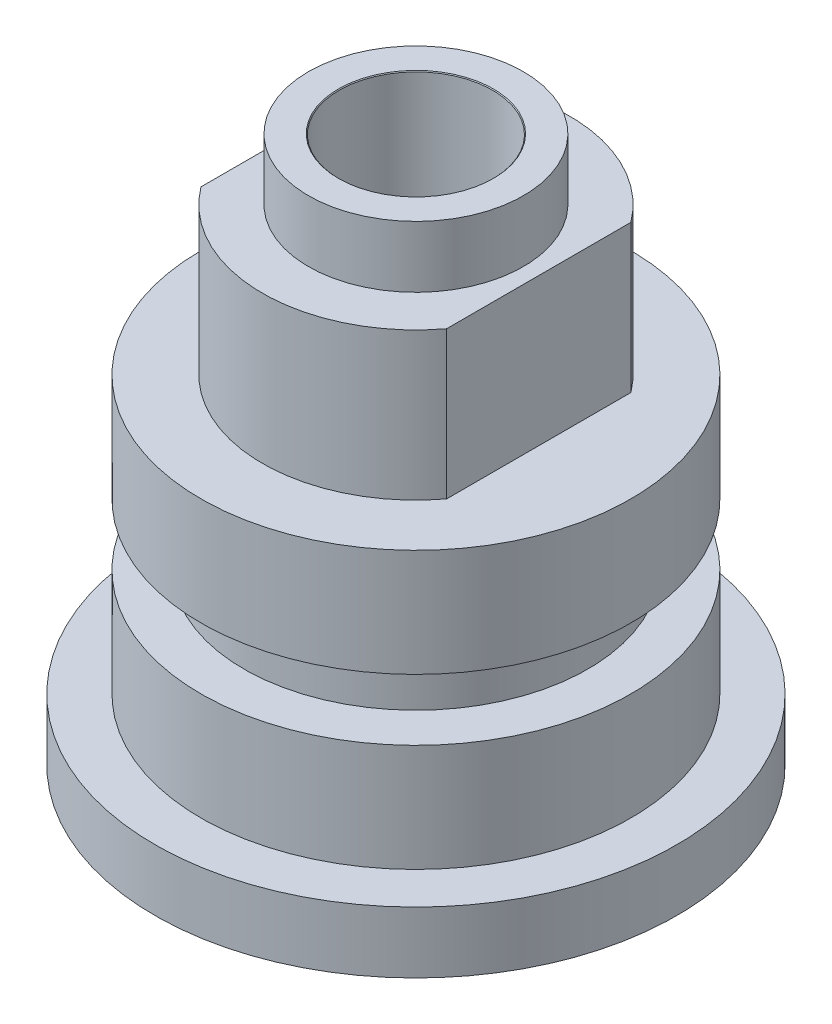
ISO-10303-21;
HEADER;
FILE_DESCRIPTION(('STEP AP214'),'2;1');
FILE_NAME('part.step','',(''),(''),'','','');
FILE_SCHEMA(('AUTOMOTIVE_DESIGN { 1 0 10303 214 1 1 1 1 }'));
ENDSEC;
DATA;
#1=APPLICATION_CONTEXT('core data for automotive mechanical design processes');
#2=APPLICATION_PROTOCOL_DEFINITION('international standard','automotive_design',2000,#1);
#3=PRODUCT_CONTEXT('',#1,'mechanical');
#4=PRODUCT('Part','Part','',(#3));
#5=PRODUCT_RELATED_PRODUCT_CATEGORY('part','',(#4));
#6=PRODUCT_DEFINITION_FORMATION('','',#4);
#7=PRODUCT_DEFINITION_CONTEXT('part definition',#1,'design');
#8=PRODUCT_DEFINITION('design','',#6,#7);
#9=PRODUCT_DEFINITION_SHAPE('','',#8);
#10=(LENGTH_UNIT() NAMED_UNIT(*) SI_UNIT(.MILLI.,.METRE.));
#11=(NAMED_UNIT(*) PLANE_ANGLE_UNIT() SI_UNIT($,.RADIAN.));
#12=(NAMED_UNIT(*) SI_UNIT($,.STERADIAN.) SOLID_ANGLE_UNIT());
#13=UNCERTAINTY_MEASURE_WITH_UNIT(LENGTH_MEASURE(1.E-05),#10,'distance_accuracy_value','');
#14=(GEOMETRIC_REPRESENTATION_CONTEXT(3) GLOBAL_UNCERTAINTY_ASSIGNED_CONTEXT((#13)) GLOBAL_UNIT_ASSIGNED_CONTEXT((#10,
#11,#12)) REPRESENTATION_CONTEXT('',''));
#15=CARTESIAN_POINT('',(0.,0.,0.));
#16=DIRECTION('',(0.,0.,1.));
#17=DIRECTION('',(1.,0.,0.));
#18=AXIS2_PLACEMENT_3D('',#15,#16,#17);
#19=CARTESIAN_POINT('',(0.,19.8,0.));
#20=DIRECTION('',(0.,1.,0.));
#21=DIRECTION('',(-1.,0.,0.));
#22=AXIS2_PLACEMENT_3D('',#19,#20,#21);
#23=CYLINDRICAL_SURFACE('',#22,5.);
#24=CARTESIAN_POINT('',(0.,0.,0.));
#25=DIRECTION('',(0.,1.,0.));
#26=DIRECTION('',(-1.,0.,0.));
#27=AXIS2_PLACEMENT_3D('',#24,#25,#26);
#28=CIRCLE('',#27,5.);
#29=CARTESIAN_POINT('',(2.5,0.,-4.33012701892219));
#30=VERTEX_POINT('',#29);
#31=CARTESIAN_POINT('',(-2.5,0.,-4.3301270189222));
#32=VERTEX_POINT('',#31);
#33=EDGE_CURVE('E45',#30,#32,#28,.T.);
#34=ORIENTED_EDGE('',*,*,#33,.T.);
#35=DIRECTION('',(0.,-1.,0.));
#36=VECTOR('',#35,1.);
#37=CARTESIAN_POINT('',(-2.5,11.01387818866,-4.3301270189222));
#38=LINE('',#37,#36);
#39=CARTESIAN_POINT('',(-2.5,2.,-4.3301270189222));
#40=VERTEX_POINT('',#39);
#41=EDGE_CURVE('E139',#40,#32,#38,.T.);
#42=ORIENTED_EDGE('',*,*,#41,.F.);
#43=CARTESIAN_POINT('',(0.,2.,0.));
#44=DIRECTION('',(0.,1.,0.));
#45=DIRECTION('',(-1.,0.,0.));
#46=AXIS2_PLACEMENT_3D('',#43,#44,#45);
#47=CIRCLE('',#46,5.);
#48=CARTESIAN_POINT('',(2.5,2.,-4.3301270189222));
#49=VERTEX_POINT('',#48);
#50=EDGE_CURVE('E204',#49,#40,#47,.T.);
#51=ORIENTED_EDGE('',*,*,#50,.F.);
#52=DIRECTION('',(0.,-1.,0.));
#53=VECTOR('',#52,1.);
#54=CARTESIAN_POINT('',(2.5,11.01387818866,-4.33012701892219));
#55=LINE('',#54,#53);
#56=EDGE_CURVE('E144',#49,#30,#55,.T.);
#57=ORIENTED_EDGE('',*,*,#56,.T.);
#58=EDGE_LOOP('',(#34,#42,#51,#57));
#59=FACE_BOUND('',#58,.T.);
#60=ADVANCED_FACE('F37',(#59),#23,.T.);
#61=CARTESIAN_POINT('',(0.,19.8,0.));
#62=DIRECTION('',(0.,1.,0.));
#63=DIRECTION('',(-1.,0.,0.));
#64=AXIS2_PLACEMENT_3D('',#61,#62,#63);
#65=CYLINDRICAL_SURFACE('',#64,5.);
#66=CARTESIAN_POINT('',(0.,13.,0.));
#67=DIRECTION('',(0.,1.,0.));
#68=DIRECTION('',(-1.,0.,0.));
#69=AXIS2_PLACEMENT_3D('',#66,#67,#68);
#70=CIRCLE('',#69,5.);
#71=CARTESIAN_POINT('',(4.,13.,-3.));
#72=VERTEX_POINT('',#71);
#73=CARTESIAN_POINT('',(-4.,13.,-3.));
#74=VERTEX_POINT('',#73);
#75=EDGE_CURVE('E177',#72,#74,#70,.T.);
#76=ORIENTED_EDGE('',*,*,#75,.T.);
#77=DIRECTION('',(0.,1.,0.));
#78=VECTOR('',#77,1.);
#79=CARTESIAN_POINT('',(-4.,6.91723746970177,-3.));
#80=LINE('',#79,#78);
#81=CARTESIAN_POINT('',(-4.,17.8,-3.));
#82=VERTEX_POINT('',#81);
#83=EDGE_CURVE('E154',#74,#82,#80,.T.);
#84=ORIENTED_EDGE('',*,*,#83,.T.);
#85=CARTESIAN_POINT('',(0.,17.8,0.));
#86=DIRECTION('',(0.,1.,0.));
#87=DIRECTION('',(-1.,0.,0.));
#88=AXIS2_PLACEMENT_3D('',#85,#86,#87);
#89=CIRCLE('',#88,5.);
#90=CARTESIAN_POINT('',(4.,17.8,-3.));
#91=VERTEX_POINT('',#90);
#92=EDGE_CURVE('E173',#91,#82,#89,.T.);
#93=ORIENTED_EDGE('',*,*,#92,.F.);
#94=DIRECTION('',(0.,1.,0.));
#95=VECTOR('',#94,1.);
#96=CARTESIAN_POINT('',(4.,6.91723746970177,-3.));
#97=LINE('',#96,#95);
#98=EDGE_CURVE('E151',#72,#91,#97,.T.);
#99=ORIENTED_EDGE('',*,*,#98,.F.);
#100=EDGE_LOOP('',(#76,#84,#93,#99));
#101=FACE_BOUND('',#100,.T.);
#102=ADVANCED_FACE('F237',(#101),#65,.T.);
#103=CARTESIAN_POINT('',(0.,0.,0.));
#104=DIRECTION('',(0.,1.,0.));
#105=DIRECTION('',(-1.,0.,0.));
#106=AXIS2_PLACEMENT_3D('',#103,#104,#105);
#107=PLANE('',#106);
#108=CARTESIAN_POINT('',(0.,0.,0.));
#109=DIRECTION('',(0.,-1.,0.));
#110=DIRECTION('',(0.,0.,-1.));
#111=AXIS2_PLACEMENT_3D('',#108,#109,#110);
#112=CIRCLE('',#111,2.025);
#113=CARTESIAN_POINT('',(0.,0.,-2.025));
#114=VERTEX_POINT('',#113);
#115=EDGE_CURVE('E115',#114,#114,#112,.T.);
#116=ORIENTED_EDGE('',*,*,#115,.F.);
#117=EDGE_LOOP('',(#116));
#118=FACE_BOUND('',#117,.T.);
#119=CARTESIAN_POINT('',(-2.5,0.,4.3301270189222));
#120=VERTEX_POINT('',#119);
#121=CARTESIAN_POINT('',(2.5,0.,4.33012701892219));
#122=VERTEX_POINT('',#121);
#123=EDGE_CURVE('E11',#120,#122,#28,.T.);
#124=ORIENTED_EDGE('',*,*,#123,.F.);
#125=DIRECTION('',(0.,0.,1.));
#126=VECTOR('',#125,1.);
#127=CARTESIAN_POINT('',(-2.5,0.,4.3301270189222));
#128=LINE('',#127,#126);
#129=EDGE_CURVE('E132',#32,#120,#128,.T.);
#130=ORIENTED_EDGE('',*,*,#129,.F.);
#131=ORIENTED_EDGE('',*,*,#33,.F.);
#132=DIRECTION('',(0.,0.,-1.));
#133=VECTOR('',#132,1.);
#134=CARTESIAN_POINT('',(2.5,0.,4.33012701892219));
#135=LINE('',#134,#133);
#136=EDGE_CURVE('E131',#122,#30,#135,.T.);
#137=ORIENTED_EDGE('',*,*,#136,.F.);
#138=EDGE_LOOP('',(#124,#130,#131,#137));
#139=FACE_BOUND('',#138,.T.);
#140=ADVANCED_FACE('F39',(#118,#139),#107,.F.);
#141=CARTESIAN_POINT('',(-2.5,2.,4.3301270189222));
#142=VERTEX_POINT('',#141);
#143=CARTESIAN_POINT('',(2.5,2.,4.33012701892219));
#144=VERTEX_POINT('',#143);
#145=EDGE_CURVE('E205',#142,#144,#47,.T.);
#146=ORIENTED_EDGE('',*,*,#145,.F.);
#147=DIRECTION('',(0.,-1.,0.));
#148=VECTOR('',#147,1.);
#149=CARTESIAN_POINT('',(-2.5,11.01387818866,4.3301270189222));
#150=LINE('',#149,#148);
#151=EDGE_CURVE('E136',#142,#120,#150,.T.);
#152=ORIENTED_EDGE('',*,*,#151,.T.);
#153=ORIENTED_EDGE('',*,*,#123,.T.);
#154=DIRECTION('',(0.,-1.,0.));
#155=VECTOR('',#154,1.);
#156=CARTESIAN_POINT('',(2.5,11.01387818866,4.33012701892219));
#157=LINE('',#156,#155);
#158=EDGE_CURVE('E134',#144,#122,#157,.T.);
#159=ORIENTED_EDGE('',*,*,#158,.F.);
#160=EDGE_LOOP('',(#146,#152,#153,#159));
#161=FACE_BOUND('',#160,.T.);
#162=ADVANCED_FACE('F221',(#161),#23,.T.);
#163=CARTESIAN_POINT('',(5.,2.,0.));
#164=DIRECTION('',(0.,1.,0.));
#165=DIRECTION('',(-1.,0.,0.));
#166=AXIS2_PLACEMENT_3D('',#163,#164,#165);
#167=PLANE('',#166);
#168=CARTESIAN_POINT('',(0.,2.,0.));
#169=DIRECTION('',(0.,1.,0.));
#170=DIRECTION('',(-1.,0.,0.));
#171=AXIS2_PLACEMENT_3D('',#168,#169,#170);
#172=CIRCLE('',#171,8.5);
#173=CARTESIAN_POINT('',(-8.5,2.,0.));
#174=VERTEX_POINT('',#173);
#175=EDGE_CURVE('E202',#174,#174,#172,.T.);
#176=ORIENTED_EDGE('',*,*,#175,.F.);
#177=EDGE_LOOP('',(#176));
#178=FACE_BOUND('',#177,.T.);
#179=ORIENTED_EDGE('',*,*,#145,.T.);
#180=DIRECTION('',(0.,0.,-1.));
#181=VECTOR('',#180,1.);
#182=CARTESIAN_POINT('',(2.5,2.,4.33012701892219));
#183=LINE('',#182,#181);
#184=EDGE_CURVE('E52',#144,#49,#183,.T.);
#185=ORIENTED_EDGE('',*,*,#184,.T.);
#186=ORIENTED_EDGE('',*,*,#50,.T.);
#187=DIRECTION('',(0.,0.,1.));
#188=VECTOR('',#187,1.);
#189=CARTESIAN_POINT('',(-2.5,2.,4.3301270189222));
#190=LINE('',#189,#188);
#191=EDGE_CURVE('E57',#40,#142,#190,.T.);
#192=ORIENTED_EDGE('',*,*,#191,.T.);
#193=EDGE_LOOP('',(#179,#185,#186,#192));
#194=FACE_BOUND('',#193,.T.);
#195=ADVANCED_FACE('F209',(#178,#194),#167,.F.);
#196=CARTESIAN_POINT('',(0.,19.8,0.));
#197=DIRECTION('',(0.,1.,0.));
#198=DIRECTION('',(-1.,0.,0.));
#199=AXIS2_PLACEMENT_3D('',#196,#197,#198);
#200=CYLINDRICAL_SURFACE('',#199,8.5);
#201=CARTESIAN_POINT('',(0.,4.,0.));
#202=DIRECTION('',(0.,1.,0.));
#203=DIRECTION('',(-1.,0.,0.));
#204=AXIS2_PLACEMENT_3D('',#201,#202,#203);
#205=CIRCLE('',#204,8.5);
#206=CARTESIAN_POINT('',(-8.5,4.,0.));
#207=VERTEX_POINT('',#206);
#208=EDGE_CURVE('E199',#207,#207,#205,.T.);
#209=ORIENTED_EDGE('',*,*,#208,.F.);
#210=EDGE_LOOP('',(#209));
#211=FACE_BOUND('',#210,.T.);
#212=ORIENTED_EDGE('',*,*,#175,.T.);
#213=EDGE_LOOP('',(#212));
#214=FACE_BOUND('',#213,.T.);
#215=ADVANCED_FACE('F250',(#211,#214),#200,.T.);
#216=CARTESIAN_POINT('',(8.5,4.,0.));
#217=DIRECTION('',(0.,-1.,0.));
#218=DIRECTION('',(1.,0.,0.));
#219=AXIS2_PLACEMENT_3D('',#216,#217,#218);
#220=PLANE('',#219);
#221=CARTESIAN_POINT('',(0.,4.,0.));
#222=DIRECTION('',(0.,1.,0.));
#223=DIRECTION('',(-1.,0.,0.));
#224=AXIS2_PLACEMENT_3D('',#221,#222,#223);
#225=CIRCLE('',#224,7.);
#226=CARTESIAN_POINT('',(-7.,4.,0.));
#227=VERTEX_POINT('',#226);
#228=EDGE_CURVE('E196',#227,#227,#225,.T.);
#229=ORIENTED_EDGE('',*,*,#228,.F.);
#230=EDGE_LOOP('',(#229));
#231=FACE_BOUND('',#230,.T.);
#232=ORIENTED_EDGE('',*,*,#208,.T.);
#233=EDGE_LOOP('',(#232));
#234=FACE_BOUND('',#233,.T.);
#235=ADVANCED_FACE('F386',(#231,#234),#220,.F.);
#236=CARTESIAN_POINT('',(0.,19.8,0.));
#237=DIRECTION('',(0.,1.,0.));
#238=DIRECTION('',(-1.,0.,0.));
#239=AXIS2_PLACEMENT_3D('',#236,#237,#238);
#240=CYLINDRICAL_SURFACE('',#239,7.);
#241=CARTESIAN_POINT('',(0.,7.5,0.));
#242=DIRECTION('',(0.,1.,0.));
#243=DIRECTION('',(-1.,0.,0.));
#244=AXIS2_PLACEMENT_3D('',#241,#242,#243);
#245=CIRCLE('',#244,7.);
#246=CARTESIAN_POINT('',(-7.,7.5,0.));
#247=VERTEX_POINT('',#246);
#248=EDGE_CURVE('E193',#247,#247,#245,.T.);
#249=ORIENTED_EDGE('',*,*,#248,.F.);
#250=EDGE_LOOP('',(#249));
#251=FACE_BOUND('',#250,.T.);
#252=ORIENTED_EDGE('',*,*,#228,.T.);
#253=EDGE_LOOP('',(#252));
#254=FACE_BOUND('',#253,.T.);
#255=ADVANCED_FACE('F382',(#251,#254),#240,.T.);
#256=CARTESIAN_POINT('',(7.,7.5,0.));
#257=DIRECTION('',(0.,-1.,0.));
#258=DIRECTION('',(1.,0.,0.));
#259=AXIS2_PLACEMENT_3D('',#256,#257,#258);
#260=PLANE('',#259);
#261=CARTESIAN_POINT('',(0.,7.5,0.));
#262=DIRECTION('',(0.,1.,0.));
#263=DIRECTION('',(-1.,0.,0.));
#264=AXIS2_PLACEMENT_3D('',#261,#262,#263);
#265=CIRCLE('',#264,5.6);
#266=CARTESIAN_POINT('',(-5.6,7.5,0.));
#267=VERTEX_POINT('',#266);
#268=EDGE_CURVE('E190',#267,#267,#265,.T.);
#269=ORIENTED_EDGE('',*,*,#268,.F.);
#270=EDGE_LOOP('',(#269));
#271=FACE_BOUND('',#270,.T.);
#272=ORIENTED_EDGE('',*,*,#248,.T.);
#273=EDGE_LOOP('',(#272));
#274=FACE_BOUND('',#273,.T.);
#275=ADVANCED_FACE('F378',(#271,#274),#260,.F.);
#276=CARTESIAN_POINT('',(0.,19.8,0.));
#277=DIRECTION('',(0.,1.,0.));
#278=DIRECTION('',(-1.,0.,0.));
#279=AXIS2_PLACEMENT_3D('',#276,#277,#278);
#280=CYLINDRICAL_SURFACE('',#279,5.6);
#281=CARTESIAN_POINT('',(0.,9.5,0.));
#282=DIRECTION('',(0.,1.,0.));
#283=DIRECTION('',(-1.,0.,0.));
#284=AXIS2_PLACEMENT_3D('',#281,#282,#283);
#285=CIRCLE('',#284,5.6);
#286=CARTESIAN_POINT('',(-5.6,9.5,0.));
#287=VERTEX_POINT('',#286);
#288=EDGE_CURVE('E187',#287,#287,#285,.T.);
#289=ORIENTED_EDGE('',*,*,#288,.F.);
#290=EDGE_LOOP('',(#289));
#291=FACE_BOUND('',#290,.T.);
#292=ORIENTED_EDGE('',*,*,#268,.T.);
#293=EDGE_LOOP('',(#292));
#294=FACE_BOUND('',#293,.T.);
#295=ADVANCED_FACE('F374',(#291,#294),#280,.T.);
#296=CARTESIAN_POINT('',(5.6,9.5,0.));
#297=DIRECTION('',(0.,1.,0.));
#298=DIRECTION('',(-1.,0.,0.));
#299=AXIS2_PLACEMENT_3D('',#296,#297,#298);
#300=PLANE('',#299);
#301=CARTESIAN_POINT('',(0.,9.5,0.));
#302=DIRECTION('',(0.,1.,0.));
#303=DIRECTION('',(-1.,0.,0.));
#304=AXIS2_PLACEMENT_3D('',#301,#302,#303);
#305=CIRCLE('',#304,7.);
#306=CARTESIAN_POINT('',(-7.,9.5,0.));
#307=VERTEX_POINT('',#306);
#308=EDGE_CURVE('E184',#307,#307,#305,.T.);
#309=ORIENTED_EDGE('',*,*,#308,.F.);
#310=EDGE_LOOP('',(#309));
#311=FACE_BOUND('',#310,.T.);
#312=ORIENTED_EDGE('',*,*,#288,.T.);
#313=EDGE_LOOP('',(#312));
#314=FACE_BOUND('',#313,.T.);
#315=ADVANCED_FACE('F370',(#311,#314),#300,.F.);
#316=CARTESIAN_POINT('',(0.,19.8,0.));
#317=DIRECTION('',(0.,1.,0.));
#318=DIRECTION('',(-1.,0.,0.));
#319=AXIS2_PLACEMENT_3D('',#316,#317,#318);
#320=CYLINDRICAL_SURFACE('',#319,7.);
#321=CARTESIAN_POINT('',(0.,13.,0.));
#322=DIRECTION('',(0.,1.,0.));
#323=DIRECTION('',(-1.,0.,0.));
#324=AXIS2_PLACEMENT_3D('',#321,#322,#323);
#325=CIRCLE('',#324,7.);
#326=CARTESIAN_POINT('',(-7.,13.,0.));
#327=VERTEX_POINT('',#326);
#328=EDGE_CURVE('E181',#327,#327,#325,.T.);
#329=ORIENTED_EDGE('',*,*,#328,.F.);
#330=EDGE_LOOP('',(#329));
#331=FACE_BOUND('',#330,.T.);
#332=ORIENTED_EDGE('',*,*,#308,.T.);
#333=EDGE_LOOP('',(#332));
#334=FACE_BOUND('',#333,.T.);
#335=ADVANCED_FACE('F367',(#331,#334),#320,.T.);
#336=CARTESIAN_POINT('',(7.,13.,0.));
#337=DIRECTION('',(0.,-1.,0.));
#338=DIRECTION('',(1.,0.,0.));
#339=AXIS2_PLACEMENT_3D('',#336,#337,#338);
#340=PLANE('',#339);
#341=CARTESIAN_POINT('',(-4.,13.,3.));
#342=VERTEX_POINT('',#341);
#343=CARTESIAN_POINT('',(4.,13.,3.));
#344=VERTEX_POINT('',#343);
#345=EDGE_CURVE('E178',#342,#344,#70,.T.);
#346=ORIENTED_EDGE('',*,*,#345,.F.);
#347=DIRECTION('',(0.,0.,-1.));
#348=VECTOR('',#347,1.);
#349=CARTESIAN_POINT('',(-4.,13.,-3.));
#350=LINE('',#349,#348);
#351=EDGE_CURVE('E150',#342,#74,#350,.T.);
#352=ORIENTED_EDGE('',*,*,#351,.T.);
#353=ORIENTED_EDGE('',*,*,#75,.F.);
#354=DIRECTION('',(0.,0.,1.));
#355=VECTOR('',#354,1.);
#356=CARTESIAN_POINT('',(4.,13.,-3.));
#357=LINE('',#356,#355);
#358=EDGE_CURVE('E161',#72,#344,#357,.T.);
#359=ORIENTED_EDGE('',*,*,#358,.T.);
#360=EDGE_LOOP('',(#346,#352,#353,#359));
#361=FACE_BOUND('',#360,.T.);
#362=ORIENTED_EDGE('',*,*,#328,.T.);
#363=EDGE_LOOP('',(#362));
#364=FACE_BOUND('',#363,.T.);
#365=ADVANCED_FACE('F356',(#361,#364),#340,.F.);
#366=CARTESIAN_POINT('',(-4.,17.8,3.));
#367=VERTEX_POINT('',#366);
#368=CARTESIAN_POINT('',(4.,17.8,3.));
#369=VERTEX_POINT('',#368);
#370=EDGE_CURVE('E174',#367,#369,#89,.T.);
#371=ORIENTED_EDGE('',*,*,#370,.F.);
#372=DIRECTION('',(0.,1.,0.));
#373=VECTOR('',#372,1.);
#374=CARTESIAN_POINT('',(-4.,6.91723746970177,3.));
#375=LINE('',#374,#373);
#376=EDGE_CURVE('E157',#342,#367,#375,.T.);
#377=ORIENTED_EDGE('',*,*,#376,.F.);
#378=ORIENTED_EDGE('',*,*,#345,.T.);
#379=DIRECTION('',(0.,1.,0.));
#380=VECTOR('',#379,1.);
#381=CARTESIAN_POINT('',(4.,6.91723746970177,3.));
#382=LINE('',#381,#380);
#383=EDGE_CURVE('E164',#344,#369,#382,.T.);
#384=ORIENTED_EDGE('',*,*,#383,.T.);
#385=EDGE_LOOP('',(#371,#377,#378,#384));
#386=FACE_BOUND('',#385,.T.);
#387=ADVANCED_FACE('F243',(#386),#65,.T.);
#388=CARTESIAN_POINT('',(5.,17.8,0.));
#389=DIRECTION('',(0.,-1.,0.));
#390=DIRECTION('',(1.,0.,0.));
#391=AXIS2_PLACEMENT_3D('',#388,#389,#390);
#392=PLANE('',#391);
#393=CARTESIAN_POINT('',(0.,17.8,0.));
#394=DIRECTION('',(0.,1.,0.));
#395=DIRECTION('',(-1.,0.,0.));
#396=AXIS2_PLACEMENT_3D('',#393,#394,#395);
#397=CIRCLE('',#396,3.5);
#398=CARTESIAN_POINT('',(-3.5,17.8,0.));
#399=VERTEX_POINT('',#398);
#400=EDGE_CURVE('E170',#399,#399,#397,.T.);
#401=ORIENTED_EDGE('',*,*,#400,.F.);
#402=EDGE_LOOP('',(#401));
#403=FACE_BOUND('',#402,.T.);
#404=ORIENTED_EDGE('',*,*,#92,.T.);
#405=DIRECTION('',(0.,0.,-1.));
#406=VECTOR('',#405,1.);
#407=CARTESIAN_POINT('',(-4.,17.8,-3.));
#408=LINE('',#407,#406);
#409=EDGE_CURVE('E148',#367,#82,#408,.T.);
#410=ORIENTED_EDGE('',*,*,#409,.F.);
#411=ORIENTED_EDGE('',*,*,#370,.T.);
#412=DIRECTION('',(0.,0.,1.));
#413=VECTOR('',#412,1.);
#414=CARTESIAN_POINT('',(4.,17.8,-3.));
#415=LINE('',#414,#413);
#416=EDGE_CURVE('E141',#91,#369,#415,.T.);
#417=ORIENTED_EDGE('',*,*,#416,.F.);
#418=EDGE_LOOP('',(#404,#410,#411,#417));
#419=FACE_BOUND('',#418,.T.);
#420=ADVANCED_FACE('F338',(#403,#419),#392,.F.);
#421=CARTESIAN_POINT('',(0.,19.8,0.));
#422=DIRECTION('',(0.,1.,0.));
#423=DIRECTION('',(-1.,0.,0.));
#424=AXIS2_PLACEMENT_3D('',#421,#422,#423);
#425=CYLINDRICAL_SURFACE('',#424,3.5);
#426=CARTESIAN_POINT('',(0.,19.8,0.));
#427=DIRECTION('',(0.,1.,0.));
#428=DIRECTION('',(-1.,0.,0.));
#429=AXIS2_PLACEMENT_3D('',#426,#427,#428);
#430=CIRCLE('',#429,3.5);
#431=CARTESIAN_POINT('',(-3.5,19.8,0.));
#432=VERTEX_POINT('',#431);
#433=EDGE_CURVE('E159',#432,#432,#430,.T.);
#434=ORIENTED_EDGE('',*,*,#433,.F.);
#435=EDGE_LOOP('',(#434));
#436=FACE_BOUND('',#435,.T.);
#437=ORIENTED_EDGE('',*,*,#400,.T.);
#438=EDGE_LOOP('',(#437));
#439=FACE_BOUND('',#438,.T.);
#440=ADVANCED_FACE('F299',(#436,#439),#425,.T.);
#441=CARTESIAN_POINT('',(3.5,19.8,0.));
#442=DIRECTION('',(0.,-1.,0.));
#443=DIRECTION('',(1.,0.,0.));
#444=AXIS2_PLACEMENT_3D('',#441,#442,#443);
#445=PLANE('',#444);
#446=CARTESIAN_POINT('',(0.,19.8,0.));
#447=DIRECTION('',(0.,1.,0.));
#448=DIRECTION('',(0.,0.,1.));
#449=AXIS2_PLACEMENT_3D('',#446,#447,#448);
#450=CIRCLE('',#449,2.525);
#451=CARTESIAN_POINT('',(0.,19.8,2.525));
#452=VERTEX_POINT('',#451);
#453=EDGE_CURVE('E122',#452,#452,#450,.T.);
#454=ORIENTED_EDGE('',*,*,#453,.F.);
#455=EDGE_LOOP('',(#454));
#456=FACE_BOUND('',#455,.T.);
#457=ORIENTED_EDGE('',*,*,#433,.T.);
#458=EDGE_LOOP('',(#457));
#459=FACE_BOUND('',#458,.T.);
#460=ADVANCED_FACE('F294',(#456,#459),#445,.F.);
#461=CARTESIAN_POINT('',(4.,6.91723746970177,-3.));
#462=DIRECTION('',(-1.,0.,0.));
#463=DIRECTION('',(0.,-1.,0.));
#464=AXIS2_PLACEMENT_3D('',#461,#462,#463);
#465=PLANE('',#464);
#466=ORIENTED_EDGE('',*,*,#98,.T.);
#467=ORIENTED_EDGE('',*,*,#416,.T.);
#468=ORIENTED_EDGE('',*,*,#383,.F.);
#469=ORIENTED_EDGE('',*,*,#358,.F.);
#470=EDGE_LOOP('',(#466,#467,#468,#469));
#471=FACE_BOUND('',#470,.T.);
#472=ADVANCED_FACE('F233',(#471),#465,.F.);
#473=CARTESIAN_POINT('',(-4.,6.91723746970177,-3.));
#474=DIRECTION('',(1.,0.,0.));
#475=DIRECTION('',(0.,1.,0.));
#476=AXIS2_PLACEMENT_3D('',#473,#474,#475);
#477=PLANE('',#476);
#478=ORIENTED_EDGE('',*,*,#376,.T.);
#479=ORIENTED_EDGE('',*,*,#409,.T.);
#480=ORIENTED_EDGE('',*,*,#83,.F.);
#481=ORIENTED_EDGE('',*,*,#351,.F.);
#482=EDGE_LOOP('',(#478,#479,#480,#481));
#483=FACE_BOUND('',#482,.T.);
#484=ADVANCED_FACE('F225',(#483),#477,.F.);
#485=CARTESIAN_POINT('',(2.5,11.01387818866,4.33012701892219));
#486=DIRECTION('',(-1.,0.,0.));
#487=DIRECTION('',(0.,-1.,0.));
#488=AXIS2_PLACEMENT_3D('',#485,#486,#487);
#489=PLANE('',#488);
#490=ORIENTED_EDGE('',*,*,#158,.T.);
#491=ORIENTED_EDGE('',*,*,#136,.T.);
#492=ORIENTED_EDGE('',*,*,#56,.F.);
#493=ORIENTED_EDGE('',*,*,#184,.F.);
#494=EDGE_LOOP('',(#490,#491,#492,#493));
#495=FACE_BOUND('',#494,.T.);
#496=ADVANCED_FACE('F223',(#495),#489,.F.);
#497=CARTESIAN_POINT('',(-2.5,11.01387818866,4.3301270189222));
#498=DIRECTION('',(1.,0.,0.));
#499=DIRECTION('',(0.,1.,0.));
#500=AXIS2_PLACEMENT_3D('',#497,#498,#499);
#501=PLANE('',#500);
#502=ORIENTED_EDGE('',*,*,#41,.T.);
#503=ORIENTED_EDGE('',*,*,#129,.T.);
#504=ORIENTED_EDGE('',*,*,#151,.F.);
#505=ORIENTED_EDGE('',*,*,#191,.F.);
#506=EDGE_LOOP('',(#502,#503,#504,#505));
#507=FACE_BOUND('',#506,.T.);
#508=ADVANCED_FACE('F215',(#507),#501,.F.);
#509=CARTESIAN_POINT('',(0.,0.798278761944878,0.));
#510=DIRECTION('',(0.,-1.,0.));
#511=DIRECTION('',(0.,0.,-1.));
#512=AXIS2_PLACEMENT_3D('',#509,#510,#511);
#513=CONICAL_SURFACE('',#512,2.,1.02974425867665);
#514=CARTESIAN_POINT('',(0.,2.,0.));
#515=VERTEX_POINT('',#514);
#516=VERTEX_LOOP('',#515);
#517=FACE_BOUND('',#516,.T.);
#518=CARTESIAN_POINT('',(0.,0.798278761944878,0.));
#519=DIRECTION('',(0.,-1.,0.));
#520=DIRECTION('',(0.,0.,-1.));
#521=AXIS2_PLACEMENT_3D('',#518,#519,#520);
#522=CIRCLE('',#521,2.);
#523=CARTESIAN_POINT('',(0.,0.798278761944878,-2.));
#524=VERTEX_POINT('',#523);
#525=EDGE_CURVE('E128',#524,#524,#522,.T.);
#526=ORIENTED_EDGE('',*,*,#525,.T.);
#527=EDGE_LOOP('',(#526));
#528=FACE_BOUND('',#527,.T.);
#529=ADVANCED_FACE('F231',(#517,#528),#513,.F.);
#530=CARTESIAN_POINT('',(0.,0.,0.));
#531=DIRECTION('',(0.,-1.,0.));
#532=DIRECTION('',(0.,0.,-1.));
#533=AXIS2_PLACEMENT_3D('',#530,#531,#532);
#534=CYLINDRICAL_SURFACE('',#533,2.);
#535=ORIENTED_EDGE('',*,*,#525,.F.);
#536=EDGE_LOOP('',(#535));
#537=FACE_BOUND('',#536,.T.);
#538=CARTESIAN_POINT('',(0.,0.0249999999999994,0.));
#539=DIRECTION('',(0.,-1.,0.));
#540=DIRECTION('',(0.,0.,-1.));
#541=AXIS2_PLACEMENT_3D('',#538,#539,#540);
#542=CIRCLE('',#541,2.);
#543=CARTESIAN_POINT('',(0.,0.0249999999999994,-2.));
#544=VERTEX_POINT('',#543);
#545=EDGE_CURVE('E119',#544,#544,#542,.T.);
#546=ORIENTED_EDGE('',*,*,#545,.T.);
#547=EDGE_LOOP('',(#546));
#548=FACE_BOUND('',#547,.T.);
#549=ADVANCED_FACE('F258',(#537,#548),#534,.F.);
#550=CARTESIAN_POINT('',(0.,0.,0.));
#551=DIRECTION('',(0.,-1.,0.));
#552=DIRECTION('',(0.,0.,-1.));
#553=AXIS2_PLACEMENT_3D('',#550,#551,#552);
#554=CONICAL_SURFACE('',#553,2.025,0.785398163397457);
#555=ORIENTED_EDGE('',*,*,#545,.F.);
#556=EDGE_LOOP('',(#555));
#557=FACE_BOUND('',#556,.T.);
#558=ORIENTED_EDGE('',*,*,#115,.T.);
#559=EDGE_LOOP('',(#558));
#560=FACE_BOUND('',#559,.T.);
#561=ADVANCED_FACE('F109',(#557,#560),#554,.F.);
#562=CARTESIAN_POINT('',(0.,14.3021515475689,0.));
#563=DIRECTION('',(0.,1.,0.));
#564=DIRECTION('',(0.,0.,1.));
#565=AXIS2_PLACEMENT_3D('',#562,#563,#564);
#566=CONICAL_SURFACE('',#565,2.5,1.02974425867665);
#567=CARTESIAN_POINT('',(0.,12.8,0.));
#568=VERTEX_POINT('',#567);
#569=VERTEX_LOOP('',#568);
#570=FACE_BOUND('',#569,.T.);
#571=CARTESIAN_POINT('',(0.,14.3021515475689,0.));
#572=DIRECTION('',(0.,1.,0.));
#573=DIRECTION('',(0.,0.,1.));
#574=AXIS2_PLACEMENT_3D('',#571,#572,#573);
#575=CIRCLE('',#574,2.5);
#576=CARTESIAN_POINT('',(0.,14.3021515475689,2.5));
#577=VERTEX_POINT('',#576);
#578=EDGE_CURVE('E113',#577,#577,#575,.T.);
#579=ORIENTED_EDGE('',*,*,#578,.T.);
#580=EDGE_LOOP('',(#579));
#581=FACE_BOUND('',#580,.T.);
#582=ADVANCED_FACE('F105',(#570,#581),#566,.F.);
#583=CARTESIAN_POINT('',(0.,19.8,0.));
#584=DIRECTION('',(0.,1.,0.));
#585=DIRECTION('',(0.,0.,1.));
#586=AXIS2_PLACEMENT_3D('',#583,#584,#585);
#587=CYLINDRICAL_SURFACE('',#586,2.5);
#588=ORIENTED_EDGE('',*,*,#578,.F.);
#589=EDGE_LOOP('',(#588));
#590=FACE_BOUND('',#589,.T.);
#591=CARTESIAN_POINT('',(0.,19.775,0.));
#592=DIRECTION('',(0.,1.,0.));
#593=DIRECTION('',(0.,0.,1.));
#594=AXIS2_PLACEMENT_3D('',#591,#592,#593);
#595=CIRCLE('',#594,2.5);
#596=CARTESIAN_POINT('',(0.,19.775,2.5));
#597=VERTEX_POINT('',#596);
#598=EDGE_CURVE('E116',#597,#597,#595,.T.);
#599=ORIENTED_EDGE('',*,*,#598,.T.);
#600=EDGE_LOOP('',(#599));
#601=FACE_BOUND('',#600,.T.);
#602=ADVANCED_FACE('F108',(#590,#601),#587,.F.);
#603=CARTESIAN_POINT('',(0.,19.8,0.));
#604=DIRECTION('',(0.,1.,0.));
#605=DIRECTION('',(0.,0.,1.));
#606=AXIS2_PLACEMENT_3D('',#603,#604,#605);
#607=CONICAL_SURFACE('',#606,2.525,0.785398163397362);
#608=ORIENTED_EDGE('',*,*,#598,.F.);
#609=EDGE_LOOP('',(#608));
#610=FACE_BOUND('',#609,.T.);
#611=ORIENTED_EDGE('',*,*,#453,.T.);
#612=EDGE_LOOP('',(#611));
#613=FACE_BOUND('',#612,.T.);
#614=ADVANCED_FACE('F318',(#610,#613),#607,.F.);
#615=CLOSED_SHELL('',(#60,#102,#140,#162,#195,#215,#235,#255,#275,#295,#315,#335,#365,#387,#420,
#440,#460,#472,#484,#496,#508,#529,#549,#561,#582,#602,#614));
#616=MANIFOLD_SOLID_BREP('B2',#615);
#617=ADVANCED_BREP_SHAPE_REPRESENTATION('',(#18,#616),#14);
#618=SHAPE_DEFINITION_REPRESENTATION(#9,#617);
ENDSEC;
END-ISO-10303-21;
